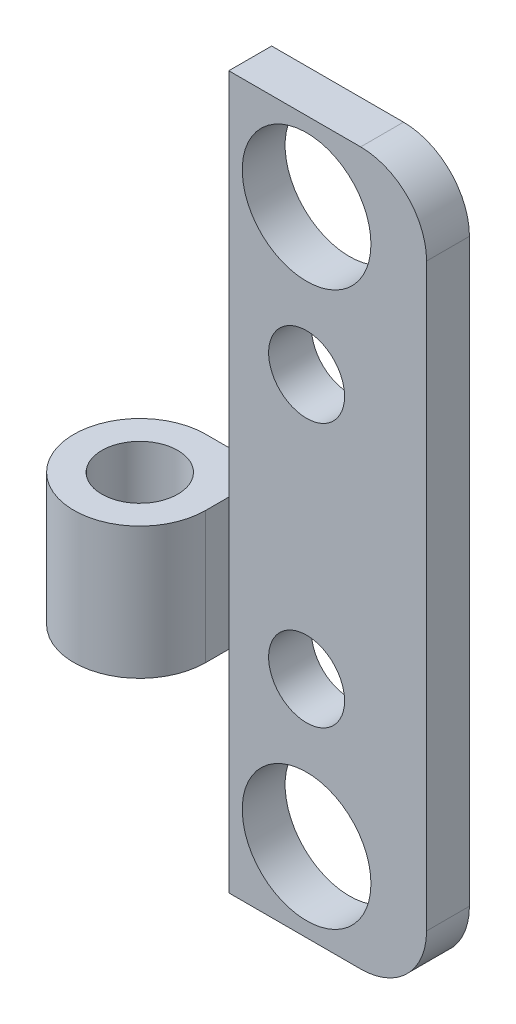
ISO-10303-21;
HEADER;
FILE_DESCRIPTION(('STEP AP214'),'2;1');
FILE_NAME('part.step','',(''),(''),'','','');
FILE_SCHEMA(('AUTOMOTIVE_DESIGN { 1 0 10303 214 1 1 1 1 }'));
ENDSEC;
DATA;
#1=APPLICATION_CONTEXT('core data for automotive mechanical design processes');
#2=APPLICATION_PROTOCOL_DEFINITION('international standard','automotive_design',2000,#1);
#3=PRODUCT_CONTEXT('',#1,'mechanical');
#4=PRODUCT('Part','Part','',(#3));
#5=PRODUCT_RELATED_PRODUCT_CATEGORY('part','',(#4));
#6=PRODUCT_DEFINITION_FORMATION('','',#4);
#7=PRODUCT_DEFINITION_CONTEXT('part definition',#1,'design');
#8=PRODUCT_DEFINITION('design','',#6,#7);
#9=PRODUCT_DEFINITION_SHAPE('','',#8);
#10=(LENGTH_UNIT() NAMED_UNIT(*) SI_UNIT(.MILLI.,.METRE.));
#11=(NAMED_UNIT(*) PLANE_ANGLE_UNIT() SI_UNIT($,.RADIAN.));
#12=(NAMED_UNIT(*) SI_UNIT($,.STERADIAN.) SOLID_ANGLE_UNIT());
#13=UNCERTAINTY_MEASURE_WITH_UNIT(LENGTH_MEASURE(1.E-05),#10,'distance_accuracy_value','');
#14=(GEOMETRIC_REPRESENTATION_CONTEXT(3) GLOBAL_UNCERTAINTY_ASSIGNED_CONTEXT((#13)) GLOBAL_UNIT_ASSIGNED_CONTEXT((#10,
#11,#12)) REPRESENTATION_CONTEXT('',''));
#15=CARTESIAN_POINT('',(0.,0.,0.));
#16=DIRECTION('',(0.,0.,1.));
#17=DIRECTION('',(1.,0.,0.));
#18=AXIS2_PLACEMENT_3D('',#15,#16,#17);
#19=CARTESIAN_POINT('',(0.,0.,4.1275));
#20=DIRECTION('',(1.,0.,0.));
#21=DIRECTION('',(0.,1.,0.));
#22=AXIS2_PLACEMENT_3D('',#19,#20,#21);
#23=PLANE('',#22);
#24=DIRECTION('',(0.,0.,1.));
#25=VECTOR('',#24,1.);
#26=CARTESIAN_POINT('',(0.,20.32,4.1275));
#27=LINE('',#26,#25);
#28=CARTESIAN_POINT('',(0.,20.32,0.));
#29=VERTEX_POINT('',#28);
#30=CARTESIAN_POINT('',(0.,20.32,4.1275));
#31=VERTEX_POINT('',#30);
#32=EDGE_CURVE('E11',#29,#31,#27,.T.);
#33=ORIENTED_EDGE('',*,*,#32,.F.);
#34=DIRECTION('',(0.,-1.,0.));
#35=VECTOR('',#34,1.);
#36=CARTESIAN_POINT('',(0.,0.,0.));
#37=LINE('',#36,#35);
#38=CARTESIAN_POINT('',(0.,0.,0.));
#39=VERTEX_POINT('',#38);
#40=EDGE_CURVE('E135',#29,#39,#37,.T.);
#41=ORIENTED_EDGE('',*,*,#40,.T.);
#42=DIRECTION('',(0.,0.,-1.));
#43=VECTOR('',#42,1.);
#44=CARTESIAN_POINT('',(0.,0.,4.1275));
#45=LINE('',#44,#43);
#46=CARTESIAN_POINT('',(0.,0.,4.1275));
#47=VERTEX_POINT('',#46);
#48=EDGE_CURVE('E149',#47,#39,#45,.T.);
#49=ORIENTED_EDGE('',*,*,#48,.F.);
#50=DIRECTION('',(0.,-1.,0.));
#51=VECTOR('',#50,1.);
#52=CARTESIAN_POINT('',(0.,0.,4.1275));
#53=LINE('',#52,#51);
#54=EDGE_CURVE('E92',#31,#47,#53,.T.);
#55=ORIENTED_EDGE('',*,*,#54,.F.);
#56=EDGE_LOOP('',(#33,#41,#49,#55));
#57=FACE_BOUND('',#56,.T.);
#58=ADVANCED_FACE('F33',(#57),#23,.F.);
#59=CARTESIAN_POINT('',(12.7,62.23,4.1275));
#60=DIRECTION('',(0.,0.,1.));
#61=DIRECTION('',(1.,0.,0.));
#62=AXIS2_PLACEMENT_3D('',#59,#60,#61);
#63=PLANE('',#62);
#64=CARTESIAN_POINT('',(7.49300000000002,21.59,4.1275));
#65=DIRECTION('',(0.,0.,1.));
#66=DIRECTION('',(1.,0.,0.));
#67=AXIS2_PLACEMENT_3D('',#64,#65,#66);
#68=CIRCLE('',#67,3.6576);
#69=CARTESIAN_POINT('',(11.1506,21.59,4.1275));
#70=VERTEX_POINT('',#69);
#71=EDGE_CURVE('E209',#70,#70,#68,.T.);
#72=ORIENTED_EDGE('',*,*,#71,.F.);
#73=EDGE_LOOP('',(#72));
#74=FACE_BOUND('',#73,.T.);
#75=CARTESIAN_POINT('',(7.49300000000006,46.99,4.1275));
#76=DIRECTION('',(0.,0.,1.));
#77=DIRECTION('',(1.,0.,0.));
#78=AXIS2_PLACEMENT_3D('',#75,#76,#77);
#79=CIRCLE('',#78,3.6576);
#80=CARTESIAN_POINT('',(11.1506000000001,46.99,4.1275));
#81=VERTEX_POINT('',#80);
#82=EDGE_CURVE('E203',#81,#81,#79,.T.);
#83=ORIENTED_EDGE('',*,*,#82,.F.);
#84=EDGE_LOOP('',(#83));
#85=FACE_BOUND('',#84,.T.);
#86=CARTESIAN_POINT('',(7.493,60.96,4.1275));
#87=DIRECTION('',(0.,0.,1.));
#88=DIRECTION('',(1.,0.,0.));
#89=AXIS2_PLACEMENT_3D('',#86,#87,#88);
#90=CIRCLE('',#89,6.19759999999999);
#91=CARTESIAN_POINT('',(13.6906,60.96,4.1275));
#92=VERTEX_POINT('',#91);
#93=EDGE_CURVE('E167',#92,#92,#90,.T.);
#94=ORIENTED_EDGE('',*,*,#93,.F.);
#95=EDGE_LOOP('',(#94));
#96=FACE_BOUND('',#95,.T.);
#97=CARTESIAN_POINT('',(0.,68.58,4.1275));
#98=VERTEX_POINT('',#97);
#99=CARTESIAN_POINT('',(0.,33.02,4.1275));
#100=VERTEX_POINT('',#99);
#101=EDGE_CURVE('E154',#98,#100,#53,.T.);
#102=ORIENTED_EDGE('',*,*,#101,.T.);
#103=EDGE_CURVE('E159',#100,#31,#53,.T.);
#104=ORIENTED_EDGE('',*,*,#103,.T.);
#105=ORIENTED_EDGE('',*,*,#54,.T.);
#106=DIRECTION('',(1.,0.,0.));
#107=VECTOR('',#106,1.);
#108=CARTESIAN_POINT('',(0.,0.,4.1275));
#109=LINE('',#108,#107);
#110=CARTESIAN_POINT('',(12.7,0.,4.1275));
#111=VERTEX_POINT('',#110);
#112=EDGE_CURVE('E160',#47,#111,#109,.T.);
#113=ORIENTED_EDGE('',*,*,#112,.T.);
#114=CARTESIAN_POINT('',(12.7,6.35,4.1275));
#115=DIRECTION('',(0.,0.,1.));
#116=DIRECTION('',(1.,0.,0.));
#117=AXIS2_PLACEMENT_3D('',#114,#115,#116);
#118=CIRCLE('',#117,6.35);
#119=CARTESIAN_POINT('',(19.05,6.35000000000005,4.1275));
#120=VERTEX_POINT('',#119);
#121=EDGE_CURVE('E110',#111,#120,#118,.T.);
#122=ORIENTED_EDGE('',*,*,#121,.T.);
#123=DIRECTION('',(0.,1.,0.));
#124=VECTOR('',#123,1.);
#125=CARTESIAN_POINT('',(19.05,6.35000000000004,4.1275));
#126=LINE('',#125,#124);
#127=CARTESIAN_POINT('',(19.05,62.23,4.1275));
#128=VERTEX_POINT('',#127);
#129=EDGE_CURVE('E102',#120,#128,#126,.T.);
#130=ORIENTED_EDGE('',*,*,#129,.T.);
#131=CARTESIAN_POINT('',(12.7,62.23,4.1275));
#132=DIRECTION('',(0.,0.,1.));
#133=DIRECTION('',(1.,0.,0.));
#134=AXIS2_PLACEMENT_3D('',#131,#132,#133);
#135=CIRCLE('',#134,6.35);
#136=CARTESIAN_POINT('',(12.7,68.58,4.1275));
#137=VERTEX_POINT('',#136);
#138=EDGE_CURVE('E107',#128,#137,#135,.T.);
#139=ORIENTED_EDGE('',*,*,#138,.T.);
#140=DIRECTION('',(-1.,0.,0.));
#141=VECTOR('',#140,1.);
#142=CARTESIAN_POINT('',(0.,68.58,4.1275));
#143=LINE('',#142,#141);
#144=EDGE_CURVE('E57',#137,#98,#143,.T.);
#145=ORIENTED_EDGE('',*,*,#144,.T.);
#146=EDGE_LOOP('',(#102,#104,#105,#113,#122,#130,#139,#145));
#147=FACE_BOUND('',#146,.T.);
#148=CARTESIAN_POINT('',(7.49300000000001,7.62,4.1275));
#149=DIRECTION('',(0.,0.,1.));
#150=DIRECTION('',(1.,0.,0.));
#151=AXIS2_PLACEMENT_3D('',#148,#149,#150);
#152=CIRCLE('',#151,6.1976);
#153=CARTESIAN_POINT('',(13.6906,7.62,4.1275));
#154=VERTEX_POINT('',#153);
#155=EDGE_CURVE('E168',#154,#154,#152,.T.);
#156=ORIENTED_EDGE('',*,*,#155,.F.);
#157=EDGE_LOOP('',(#156));
#158=FACE_BOUND('',#157,.T.);
#159=ADVANCED_FACE('F104',(#74,#85,#96,#147,#158),#63,.T.);
#160=CARTESIAN_POINT('',(12.7,62.23,0.));
#161=DIRECTION('',(0.,0.,1.));
#162=DIRECTION('',(1.,0.,0.));
#163=AXIS2_PLACEMENT_3D('',#160,#161,#162);
#164=PLANE('',#163);
#165=CARTESIAN_POINT('',(7.49300000000002,21.59,0.));
#166=DIRECTION('',(0.,0.,1.));
#167=DIRECTION('',(1.,0.,0.));
#168=AXIS2_PLACEMENT_3D('',#165,#166,#167);
#169=CIRCLE('',#168,3.6576);
#170=CARTESIAN_POINT('',(11.1506,21.59,0.));
#171=VERTEX_POINT('',#170);
#172=EDGE_CURVE('E206',#171,#171,#169,.T.);
#173=ORIENTED_EDGE('',*,*,#172,.T.);
#174=EDGE_LOOP('',(#173));
#175=FACE_BOUND('',#174,.T.);
#176=CARTESIAN_POINT('',(7.49300000000006,46.99,0.));
#177=DIRECTION('',(0.,0.,1.));
#178=DIRECTION('',(1.,0.,0.));
#179=AXIS2_PLACEMENT_3D('',#176,#177,#178);
#180=CIRCLE('',#179,3.6576);
#181=CARTESIAN_POINT('',(11.1506000000001,46.99,0.));
#182=VERTEX_POINT('',#181);
#183=EDGE_CURVE('E200',#182,#182,#180,.T.);
#184=ORIENTED_EDGE('',*,*,#183,.T.);
#185=EDGE_LOOP('',(#184));
#186=FACE_BOUND('',#185,.T.);
#187=CARTESIAN_POINT('',(0.,68.58,0.));
#188=VERTEX_POINT('',#187);
#189=CARTESIAN_POINT('',(0.,33.02,0.));
#190=VERTEX_POINT('',#189);
#191=EDGE_CURVE('E131',#188,#190,#37,.T.);
#192=ORIENTED_EDGE('',*,*,#191,.F.);
#193=DIRECTION('',(-1.,0.,0.));
#194=VECTOR('',#193,1.);
#195=CARTESIAN_POINT('',(0.,68.58,0.));
#196=LINE('',#195,#194);
#197=CARTESIAN_POINT('',(12.7,68.58,0.));
#198=VERTEX_POINT('',#197);
#199=EDGE_CURVE('E84',#198,#188,#196,.T.);
#200=ORIENTED_EDGE('',*,*,#199,.F.);
#201=CARTESIAN_POINT('',(12.7,62.23,0.));
#202=DIRECTION('',(0.,0.,1.));
#203=DIRECTION('',(1.,0.,0.));
#204=AXIS2_PLACEMENT_3D('',#201,#202,#203);
#205=CIRCLE('',#204,6.35);
#206=CARTESIAN_POINT('',(19.05,62.23,0.));
#207=VERTEX_POINT('',#206);
#208=EDGE_CURVE('E140',#207,#198,#205,.T.);
#209=ORIENTED_EDGE('',*,*,#208,.F.);
#210=DIRECTION('',(0.,1.,0.));
#211=VECTOR('',#210,1.);
#212=CARTESIAN_POINT('',(19.05,6.35000000000004,0.));
#213=LINE('',#212,#211);
#214=CARTESIAN_POINT('',(19.05,6.35000000000005,0.));
#215=VERTEX_POINT('',#214);
#216=EDGE_CURVE('E119',#215,#207,#213,.T.);
#217=ORIENTED_EDGE('',*,*,#216,.F.);
#218=CARTESIAN_POINT('',(12.7,6.35,0.));
#219=DIRECTION('',(0.,0.,1.));
#220=DIRECTION('',(1.,0.,0.));
#221=AXIS2_PLACEMENT_3D('',#218,#219,#220);
#222=CIRCLE('',#221,6.35);
#223=CARTESIAN_POINT('',(12.7,0.,0.));
#224=VERTEX_POINT('',#223);
#225=EDGE_CURVE('E137',#224,#215,#222,.T.);
#226=ORIENTED_EDGE('',*,*,#225,.F.);
#227=DIRECTION('',(1.,0.,0.));
#228=VECTOR('',#227,1.);
#229=CARTESIAN_POINT('',(0.,0.,0.));
#230=LINE('',#229,#228);
#231=EDGE_CURVE('E134',#39,#224,#230,.T.);
#232=ORIENTED_EDGE('',*,*,#231,.F.);
#233=ORIENTED_EDGE('',*,*,#40,.F.);
#234=DIRECTION('',(-1.,0.,0.));
#235=VECTOR('',#234,1.);
#236=CARTESIAN_POINT('',(0.,20.32,0.));
#237=LINE('',#236,#235);
#238=CARTESIAN_POINT('',(-6.35,20.32,0.));
#239=VERTEX_POINT('',#238);
#240=EDGE_CURVE('E192',#29,#239,#237,.T.);
#241=ORIENTED_EDGE('',*,*,#240,.T.);
#242=DIRECTION('',(0.,1.,0.));
#243=VECTOR('',#242,1.);
#244=CARTESIAN_POINT('',(-6.35,20.32,0.));
#245=LINE('',#244,#243);
#246=CARTESIAN_POINT('',(-6.35,33.02,0.));
#247=VERTEX_POINT('',#246);
#248=EDGE_CURVE('E177',#239,#247,#245,.T.);
#249=ORIENTED_EDGE('',*,*,#248,.T.);
#250=DIRECTION('',(-1.,0.,0.));
#251=VECTOR('',#250,1.);
#252=CARTESIAN_POINT('',(0.,33.02,0.));
#253=LINE('',#252,#251);
#254=EDGE_CURVE('E187',#190,#247,#253,.T.);
#255=ORIENTED_EDGE('',*,*,#254,.F.);
#256=EDGE_LOOP('',(#192,#200,#209,#217,#226,#232,#233,#241,#249,#255));
#257=FACE_BOUND('',#256,.T.);
#258=CARTESIAN_POINT('',(7.493,60.96,0.));
#259=DIRECTION('',(0.,0.,1.));
#260=DIRECTION('',(1.,0.,0.));
#261=AXIS2_PLACEMENT_3D('',#258,#259,#260);
#262=CIRCLE('',#261,6.19759999999999);
#263=CARTESIAN_POINT('',(13.6906,60.96,0.));
#264=VERTEX_POINT('',#263);
#265=EDGE_CURVE('E164',#264,#264,#262,.T.);
#266=ORIENTED_EDGE('',*,*,#265,.T.);
#267=EDGE_LOOP('',(#266));
#268=FACE_BOUND('',#267,.T.);
#269=CARTESIAN_POINT('',(7.49300000000001,7.62,0.));
#270=DIRECTION('',(0.,0.,1.));
#271=DIRECTION('',(1.,0.,0.));
#272=AXIS2_PLACEMENT_3D('',#269,#270,#271);
#273=CIRCLE('',#272,6.1976);
#274=CARTESIAN_POINT('',(13.6906,7.62,0.));
#275=VERTEX_POINT('',#274);
#276=EDGE_CURVE('E171',#275,#275,#273,.T.);
#277=ORIENTED_EDGE('',*,*,#276,.T.);
#278=EDGE_LOOP('',(#277));
#279=FACE_BOUND('',#278,.T.);
#280=ADVANCED_FACE('F215',(#175,#186,#257,#268,#279),#164,.F.);
#281=ORIENTED_EDGE('',*,*,#191,.T.);
#282=DIRECTION('',(0.,0.,1.));
#283=VECTOR('',#282,1.);
#284=CARTESIAN_POINT('',(0.,33.02,4.1275));
#285=LINE('',#284,#283);
#286=EDGE_CURVE('E41',#190,#100,#285,.T.);
#287=ORIENTED_EDGE('',*,*,#286,.T.);
#288=ORIENTED_EDGE('',*,*,#101,.F.);
#289=DIRECTION('',(0.,0.,-1.));
#290=VECTOR('',#289,1.);
#291=CARTESIAN_POINT('',(0.,68.58,4.1275));
#292=LINE('',#291,#290);
#293=EDGE_CURVE('E127',#98,#188,#292,.T.);
#294=ORIENTED_EDGE('',*,*,#293,.T.);
#295=EDGE_LOOP('',(#281,#287,#288,#294));
#296=FACE_BOUND('',#295,.T.);
#297=ADVANCED_FACE('F35',(#296),#23,.F.);
#298=CARTESIAN_POINT('',(0.,0.,4.1275));
#299=DIRECTION('',(0.,1.,0.));
#300=DIRECTION('',(0.,0.,1.));
#301=AXIS2_PLACEMENT_3D('',#298,#299,#300);
#302=PLANE('',#301);
#303=ORIENTED_EDGE('',*,*,#231,.T.);
#304=DIRECTION('',(0.,0.,-1.));
#305=VECTOR('',#304,1.);
#306=CARTESIAN_POINT('',(12.7,0.,4.1275));
#307=LINE('',#306,#305);
#308=EDGE_CURVE('E146',#111,#224,#307,.T.);
#309=ORIENTED_EDGE('',*,*,#308,.F.);
#310=ORIENTED_EDGE('',*,*,#112,.F.);
#311=ORIENTED_EDGE('',*,*,#48,.T.);
#312=EDGE_LOOP('',(#303,#309,#310,#311));
#313=FACE_BOUND('',#312,.T.);
#314=ADVANCED_FACE('F262',(#313),#302,.F.);
#315=CARTESIAN_POINT('',(12.7,6.35,4.1275));
#316=DIRECTION('',(0.,0.,-1.));
#317=DIRECTION('',(-1.,0.,0.));
#318=AXIS2_PLACEMENT_3D('',#315,#316,#317);
#319=CYLINDRICAL_SURFACE('',#318,6.35);
#320=ORIENTED_EDGE('',*,*,#225,.T.);
#321=DIRECTION('',(0.,0.,-1.));
#322=VECTOR('',#321,1.);
#323=CARTESIAN_POINT('',(19.05,6.35000000000005,4.1275));
#324=LINE('',#323,#322);
#325=EDGE_CURVE('E122',#120,#215,#324,.T.);
#326=ORIENTED_EDGE('',*,*,#325,.F.);
#327=ORIENTED_EDGE('',*,*,#121,.F.);
#328=ORIENTED_EDGE('',*,*,#308,.T.);
#329=EDGE_LOOP('',(#320,#326,#327,#328));
#330=FACE_BOUND('',#329,.T.);
#331=ADVANCED_FACE('F266',(#330),#319,.T.);
#332=CARTESIAN_POINT('',(19.05,6.35000000000004,4.1275));
#333=DIRECTION('',(-1.,0.,0.));
#334=DIRECTION('',(0.,-1.,0.));
#335=AXIS2_PLACEMENT_3D('',#332,#333,#334);
#336=PLANE('',#335);
#337=ORIENTED_EDGE('',*,*,#216,.T.);
#338=DIRECTION('',(0.,0.,-1.));
#339=VECTOR('',#338,1.);
#340=CARTESIAN_POINT('',(19.05,62.23,4.1275));
#341=LINE('',#340,#339);
#342=EDGE_CURVE('E116',#128,#207,#341,.T.);
#343=ORIENTED_EDGE('',*,*,#342,.F.);
#344=ORIENTED_EDGE('',*,*,#129,.F.);
#345=ORIENTED_EDGE('',*,*,#325,.T.);
#346=EDGE_LOOP('',(#337,#343,#344,#345));
#347=FACE_BOUND('',#346,.T.);
#348=ADVANCED_FACE('F117',(#347),#336,.F.);
#349=CARTESIAN_POINT('',(12.7,62.23,4.1275));
#350=DIRECTION('',(0.,0.,-1.));
#351=DIRECTION('',(-1.,0.,0.));
#352=AXIS2_PLACEMENT_3D('',#349,#350,#351);
#353=CYLINDRICAL_SURFACE('',#352,6.35);
#354=ORIENTED_EDGE('',*,*,#208,.T.);
#355=DIRECTION('',(0.,0.,-1.));
#356=VECTOR('',#355,1.);
#357=CARTESIAN_POINT('',(12.7,68.58,4.1275));
#358=LINE('',#357,#356);
#359=EDGE_CURVE('E123',#137,#198,#358,.T.);
#360=ORIENTED_EDGE('',*,*,#359,.F.);
#361=ORIENTED_EDGE('',*,*,#138,.F.);
#362=ORIENTED_EDGE('',*,*,#342,.T.);
#363=EDGE_LOOP('',(#354,#360,#361,#362));
#364=FACE_BOUND('',#363,.T.);
#365=ADVANCED_FACE('F125',(#364),#353,.T.);
#366=CARTESIAN_POINT('',(0.,68.58,4.1275));
#367=DIRECTION('',(0.,-1.,0.));
#368=DIRECTION('',(0.,0.,-1.));
#369=AXIS2_PLACEMENT_3D('',#366,#367,#368);
#370=PLANE('',#369);
#371=ORIENTED_EDGE('',*,*,#199,.T.);
#372=ORIENTED_EDGE('',*,*,#293,.F.);
#373=ORIENTED_EDGE('',*,*,#144,.F.);
#374=ORIENTED_EDGE('',*,*,#359,.T.);
#375=EDGE_LOOP('',(#371,#372,#373,#374));
#376=FACE_BOUND('',#375,.T.);
#377=ADVANCED_FACE('F236',(#376),#370,.F.);
#378=CARTESIAN_POINT('',(7.493,60.96,4.1275));
#379=DIRECTION('',(0.,0.,-1.));
#380=DIRECTION('',(-1.,0.,0.));
#381=AXIS2_PLACEMENT_3D('',#378,#379,#380);
#382=CYLINDRICAL_SURFACE('',#381,6.19759999999999);
#383=ORIENTED_EDGE('',*,*,#93,.T.);
#384=EDGE_LOOP('',(#383));
#385=FACE_BOUND('',#384,.T.);
#386=ORIENTED_EDGE('',*,*,#265,.F.);
#387=EDGE_LOOP('',(#386));
#388=FACE_BOUND('',#387,.T.);
#389=ADVANCED_FACE('F232',(#385,#388),#382,.F.);
#390=CARTESIAN_POINT('',(7.49300000000001,7.62,4.1275));
#391=DIRECTION('',(0.,0.,-1.));
#392=DIRECTION('',(-1.,0.,0.));
#393=AXIS2_PLACEMENT_3D('',#390,#391,#392);
#394=CYLINDRICAL_SURFACE('',#393,6.1976);
#395=ORIENTED_EDGE('',*,*,#155,.T.);
#396=EDGE_LOOP('',(#395));
#397=FACE_BOUND('',#396,.T.);
#398=ORIENTED_EDGE('',*,*,#276,.F.);
#399=EDGE_LOOP('',(#398));
#400=FACE_BOUND('',#399,.T.);
#401=ADVANCED_FACE('F235',(#397,#400),#394,.F.);
#402=CARTESIAN_POINT('',(0.,20.32,6.35));
#403=DIRECTION('',(1.,0.,0.));
#404=DIRECTION('',(0.,0.,-1.));
#405=AXIS2_PLACEMENT_3D('',#402,#403,#404);
#406=PLANE('',#405);
#407=DIRECTION('',(0.,0.,-1.));
#408=VECTOR('',#407,1.);
#409=CARTESIAN_POINT('',(0.,20.32,4.1275));
#410=LINE('',#409,#408);
#411=CARTESIAN_POINT('',(0.,20.32,6.35));
#412=VERTEX_POINT('',#411);
#413=EDGE_CURVE('E184',#412,#31,#410,.T.);
#414=ORIENTED_EDGE('',*,*,#413,.T.);
#415=ORIENTED_EDGE('',*,*,#103,.F.);
#416=DIRECTION('',(0.,0.,-1.));
#417=VECTOR('',#416,1.);
#418=CARTESIAN_POINT('',(0.,33.02,6.35));
#419=LINE('',#418,#417);
#420=CARTESIAN_POINT('',(0.,33.02,6.35));
#421=VERTEX_POINT('',#420);
#422=EDGE_CURVE('E48',#421,#100,#419,.T.);
#423=ORIENTED_EDGE('',*,*,#422,.F.);
#424=DIRECTION('',(0.,1.,0.));
#425=VECTOR('',#424,1.);
#426=CARTESIAN_POINT('',(0.,20.32,6.35));
#427=LINE('',#426,#425);
#428=EDGE_CURVE('E174',#412,#421,#427,.T.);
#429=ORIENTED_EDGE('',*,*,#428,.F.);
#430=EDGE_LOOP('',(#414,#415,#423,#429));
#431=FACE_BOUND('',#430,.T.);
#432=ADVANCED_FACE('F246',(#431),#406,.T.);
#433=CARTESIAN_POINT('',(-6.35,20.32,6.35));
#434=DIRECTION('',(0.,1.,0.));
#435=DIRECTION('',(0.,0.,1.));
#436=AXIS2_PLACEMENT_3D('',#433,#434,#435);
#437=CYLINDRICAL_SURFACE('',#436,6.35);
#438=CARTESIAN_POINT('',(-6.35,33.02,6.35));
#439=DIRECTION('',(0.,1.,0.));
#440=DIRECTION('',(0.,0.,1.));
#441=AXIS2_PLACEMENT_3D('',#438,#439,#440);
#442=CIRCLE('',#441,6.35);
#443=EDGE_CURVE('E185',#247,#421,#442,.T.);
#444=ORIENTED_EDGE('',*,*,#443,.F.);
#445=ORIENTED_EDGE('',*,*,#248,.F.);
#446=CARTESIAN_POINT('',(-6.35,20.32,6.35));
#447=DIRECTION('',(0.,1.,0.));
#448=DIRECTION('',(0.,0.,1.));
#449=AXIS2_PLACEMENT_3D('',#446,#447,#448);
#450=CIRCLE('',#449,6.35);
#451=EDGE_CURVE('E180',#239,#412,#450,.T.);
#452=ORIENTED_EDGE('',*,*,#451,.T.);
#453=ORIENTED_EDGE('',*,*,#428,.T.);
#454=EDGE_LOOP('',(#444,#445,#452,#453));
#455=FACE_BOUND('',#454,.T.);
#456=ADVANCED_FACE('F252',(#455),#437,.T.);
#457=CARTESIAN_POINT('',(-6.35,20.32,6.35));
#458=DIRECTION('',(0.,1.,0.));
#459=DIRECTION('',(0.,0.,1.));
#460=AXIS2_PLACEMENT_3D('',#457,#458,#459);
#461=PLANE('',#460);
#462=CARTESIAN_POINT('',(-6.35,20.32,6.35));
#463=DIRECTION('',(0.,1.,0.));
#464=DIRECTION('',(0.,0.,1.));
#465=AXIS2_PLACEMENT_3D('',#462,#463,#464);
#466=CIRCLE('',#465,3.6576);
#467=CARTESIAN_POINT('',(-6.35,20.32,10.0076));
#468=VERTEX_POINT('',#467);
#469=EDGE_CURVE('E189',#468,#468,#466,.T.);
#470=ORIENTED_EDGE('',*,*,#469,.T.);
#471=EDGE_LOOP('',(#470));
#472=FACE_BOUND('',#471,.T.);
#473=ORIENTED_EDGE('',*,*,#413,.F.);
#474=ORIENTED_EDGE('',*,*,#451,.F.);
#475=ORIENTED_EDGE('',*,*,#240,.F.);
#476=ORIENTED_EDGE('',*,*,#32,.T.);
#477=EDGE_LOOP('',(#473,#474,#475,#476));
#478=FACE_BOUND('',#477,.T.);
#479=ADVANCED_FACE('F318',(#472,#478),#461,.F.);
#480=CARTESIAN_POINT('',(-6.35,33.02,6.35));
#481=DIRECTION('',(0.,1.,0.));
#482=DIRECTION('',(0.,0.,1.));
#483=AXIS2_PLACEMENT_3D('',#480,#481,#482);
#484=PLANE('',#483);
#485=CARTESIAN_POINT('',(-6.35,33.02,6.35));
#486=DIRECTION('',(0.,1.,0.));
#487=DIRECTION('',(0.,0.,1.));
#488=AXIS2_PLACEMENT_3D('',#485,#486,#487);
#489=CIRCLE('',#488,3.6576);
#490=CARTESIAN_POINT('',(-6.35,33.02,10.0076));
#491=VERTEX_POINT('',#490);
#492=EDGE_CURVE('E197',#491,#491,#489,.T.);
#493=ORIENTED_EDGE('',*,*,#492,.F.);
#494=EDGE_LOOP('',(#493));
#495=FACE_BOUND('',#494,.T.);
#496=ORIENTED_EDGE('',*,*,#422,.T.);
#497=ORIENTED_EDGE('',*,*,#286,.F.);
#498=ORIENTED_EDGE('',*,*,#254,.T.);
#499=ORIENTED_EDGE('',*,*,#443,.T.);
#500=EDGE_LOOP('',(#496,#497,#498,#499));
#501=FACE_BOUND('',#500,.T.);
#502=ADVANCED_FACE('F327',(#495,#501),#484,.T.);
#503=CARTESIAN_POINT('',(-6.35,20.32,6.35));
#504=DIRECTION('',(0.,1.,0.));
#505=DIRECTION('',(0.,0.,1.));
#506=AXIS2_PLACEMENT_3D('',#503,#504,#505);
#507=CYLINDRICAL_SURFACE('',#506,3.6576);
#508=ORIENTED_EDGE('',*,*,#469,.F.);
#509=EDGE_LOOP('',(#508));
#510=FACE_BOUND('',#509,.T.);
#511=ORIENTED_EDGE('',*,*,#492,.T.);
#512=EDGE_LOOP('',(#511));
#513=FACE_BOUND('',#512,.T.);
#514=ADVANCED_FACE('F337',(#510,#513),#507,.F.);
#515=CARTESIAN_POINT('',(7.49300000000006,46.99,0.));
#516=DIRECTION('',(0.,0.,1.));
#517=DIRECTION('',(1.,0.,0.));
#518=AXIS2_PLACEMENT_3D('',#515,#516,#517);
#519=CYLINDRICAL_SURFACE('',#518,3.6576);
#520=ORIENTED_EDGE('',*,*,#183,.F.);
#521=EDGE_LOOP('',(#520));
#522=FACE_BOUND('',#521,.T.);
#523=ORIENTED_EDGE('',*,*,#82,.T.);
#524=EDGE_LOOP('',(#523));
#525=FACE_BOUND('',#524,.T.);
#526=ADVANCED_FACE('F221',(#522,#525),#519,.F.);
#527=CARTESIAN_POINT('',(7.49300000000002,21.59,0.));
#528=DIRECTION('',(0.,0.,1.));
#529=DIRECTION('',(1.,0.,0.));
#530=AXIS2_PLACEMENT_3D('',#527,#528,#529);
#531=CYLINDRICAL_SURFACE('',#530,3.6576);
#532=ORIENTED_EDGE('',*,*,#172,.F.);
#533=EDGE_LOOP('',(#532));
#534=FACE_BOUND('',#533,.T.);
#535=ORIENTED_EDGE('',*,*,#71,.T.);
#536=EDGE_LOOP('',(#535));
#537=FACE_BOUND('',#536,.T.);
#538=ADVANCED_FACE('F218',(#534,#537),#531,.F.);
#539=CLOSED_SHELL('',(#58,#159,#280,#297,#314,#331,#348,#365,#377,#389,#401,#432,#456,#479,#502,
#514,#526,#538));
#540=MANIFOLD_SOLID_BREP('B2',#539);
#541=ADVANCED_BREP_SHAPE_REPRESENTATION('',(#18,#540),#14);
#542=SHAPE_DEFINITION_REPRESENTATION(#9,#541);
ENDSEC;
END-ISO-10303-21;
